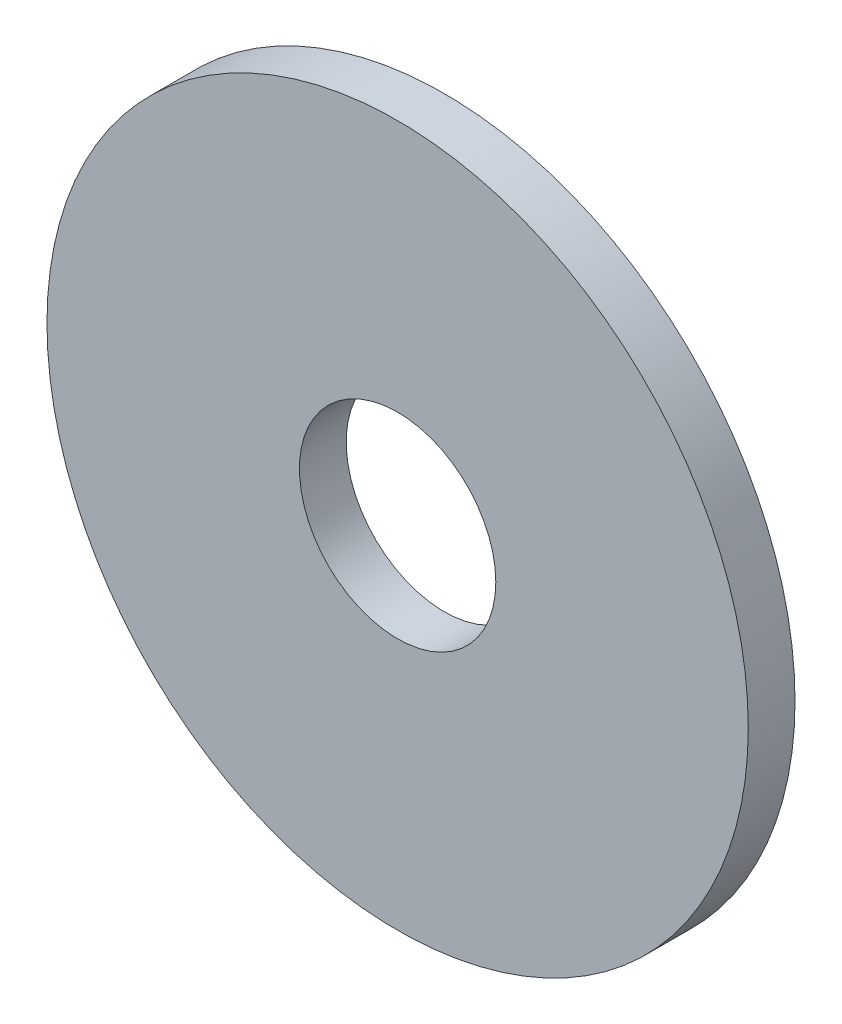
ISO-10303-21;
HEADER;
FILE_DESCRIPTION(('STEP AP214'),'2;1');
FILE_NAME('part.step','',(''),(''),'','','');
FILE_SCHEMA(('AUTOMOTIVE_DESIGN { 1 0 10303 214 1 1 1 1 }'));
ENDSEC;
DATA;
#1=APPLICATION_CONTEXT('core data for automotive mechanical design processes');
#2=APPLICATION_PROTOCOL_DEFINITION('international standard','automotive_design',2000,#1);
#3=PRODUCT_CONTEXT('',#1,'mechanical');
#4=PRODUCT('Part','Part','',(#3));
#5=PRODUCT_RELATED_PRODUCT_CATEGORY('part','',(#4));
#6=PRODUCT_DEFINITION_FORMATION('','',#4);
#7=PRODUCT_DEFINITION_CONTEXT('part definition',#1,'design');
#8=PRODUCT_DEFINITION('design','',#6,#7);
#9=PRODUCT_DEFINITION_SHAPE('','',#8);
#10=(LENGTH_UNIT() NAMED_UNIT(*) SI_UNIT(.MILLI.,.METRE.));
#11=(NAMED_UNIT(*) PLANE_ANGLE_UNIT() SI_UNIT($,.RADIAN.));
#12=(NAMED_UNIT(*) SI_UNIT($,.STERADIAN.) SOLID_ANGLE_UNIT());
#13=UNCERTAINTY_MEASURE_WITH_UNIT(LENGTH_MEASURE(1.E-05),#10,'distance_accuracy_value','');
#14=(GEOMETRIC_REPRESENTATION_CONTEXT(3) GLOBAL_UNCERTAINTY_ASSIGNED_CONTEXT((#13)) GLOBAL_UNIT_ASSIGNED_CONTEXT((#10,
#11,#12)) REPRESENTATION_CONTEXT('',''));
#15=CARTESIAN_POINT('',(0.,0.,0.));
#16=DIRECTION('',(0.,0.,1.));
#17=DIRECTION('',(1.,0.,0.));
#18=AXIS2_PLACEMENT_3D('',#15,#16,#17);
#19=CARTESIAN_POINT('',(0.,0.,1.));
#20=DIRECTION('',(0.,0.,1.));
#21=DIRECTION('',(1.,0.,0.));
#22=AXIS2_PLACEMENT_3D('',#19,#20,#21);
#23=PLANE('',#22);
#24=CARTESIAN_POINT('',(0.,0.,1.));
#25=DIRECTION('',(0.,0.,1.));
#26=DIRECTION('',(1.,0.,0.));
#27=AXIS2_PLACEMENT_3D('',#24,#25,#26);
#28=CIRCLE('',#27,15.);
#29=CARTESIAN_POINT('',(15.,0.,1.));
#30=VERTEX_POINT('',#29);
#31=EDGE_CURVE('E10',#30,#30,#28,.T.);
#32=ORIENTED_EDGE('',*,*,#31,.T.);
#33=EDGE_LOOP('',(#32));
#34=FACE_BOUND('',#33,.T.);
#35=CARTESIAN_POINT('',(0.,0.,1.));
#36=DIRECTION('',(0.,0.,1.));
#37=DIRECTION('',(1.,0.,0.));
#38=AXIS2_PLACEMENT_3D('',#35,#36,#37);
#39=CIRCLE('',#38,4.2);
#40=CARTESIAN_POINT('',(4.2,0.,1.));
#41=VERTEX_POINT('',#40);
#42=EDGE_CURVE('E42',#41,#41,#39,.T.);
#43=ORIENTED_EDGE('',*,*,#42,.F.);
#44=EDGE_LOOP('',(#43));
#45=FACE_BOUND('',#44,.T.);
#46=ADVANCED_FACE('F31',(#34,#45),#23,.T.);
#47=CARTESIAN_POINT('',(0.,0.,-1.));
#48=DIRECTION('',(0.,0.,1.));
#49=DIRECTION('',(1.,0.,0.));
#50=AXIS2_PLACEMENT_3D('',#47,#48,#49);
#51=PLANE('',#50);
#52=CARTESIAN_POINT('',(0.,0.,-1.));
#53=DIRECTION('',(0.,0.,1.));
#54=DIRECTION('',(1.,0.,0.));
#55=AXIS2_PLACEMENT_3D('',#52,#53,#54);
#56=CIRCLE('',#55,15.);
#57=CARTESIAN_POINT('',(15.,0.,-1.));
#58=VERTEX_POINT('',#57);
#59=EDGE_CURVE('E35',#58,#58,#56,.T.);
#60=ORIENTED_EDGE('',*,*,#59,.F.);
#61=EDGE_LOOP('',(#60));
#62=FACE_BOUND('',#61,.T.);
#63=CARTESIAN_POINT('',(0.,0.,-1.));
#64=DIRECTION('',(0.,0.,1.));
#65=DIRECTION('',(1.,0.,0.));
#66=AXIS2_PLACEMENT_3D('',#63,#64,#65);
#67=CIRCLE('',#66,4.2);
#68=CARTESIAN_POINT('',(4.2,0.,-1.));
#69=VERTEX_POINT('',#68);
#70=EDGE_CURVE('E44',#69,#69,#67,.T.);
#71=ORIENTED_EDGE('',*,*,#70,.T.);
#72=EDGE_LOOP('',(#71));
#73=FACE_BOUND('',#72,.T.);
#74=ADVANCED_FACE('F54',(#62,#73),#51,.F.);
#75=CARTESIAN_POINT('',(0.,0.,1.));
#76=DIRECTION('',(0.,0.,-1.));
#77=DIRECTION('',(-1.,0.,0.));
#78=AXIS2_PLACEMENT_3D('',#75,#76,#77);
#79=CYLINDRICAL_SURFACE('',#78,15.);
#80=ORIENTED_EDGE('',*,*,#31,.F.);
#81=EDGE_LOOP('',(#80));
#82=FACE_BOUND('',#81,.T.);
#83=ORIENTED_EDGE('',*,*,#59,.T.);
#84=EDGE_LOOP('',(#83));
#85=FACE_BOUND('',#84,.T.);
#86=ADVANCED_FACE('F33',(#82,#85),#79,.T.);
#87=CARTESIAN_POINT('',(0.,0.,1.));
#88=DIRECTION('',(0.,0.,-1.));
#89=DIRECTION('',(-1.,0.,0.));
#90=AXIS2_PLACEMENT_3D('',#87,#88,#89);
#91=CYLINDRICAL_SURFACE('',#90,4.2);
#92=ORIENTED_EDGE('',*,*,#42,.T.);
#93=EDGE_LOOP('',(#92));
#94=FACE_BOUND('',#93,.T.);
#95=ORIENTED_EDGE('',*,*,#70,.F.);
#96=EDGE_LOOP('',(#95));
#97=FACE_BOUND('',#96,.T.);
#98=ADVANCED_FACE('F50',(#94,#97),#91,.F.);
#99=CLOSED_SHELL('',(#46,#74,#86,#98));
#100=MANIFOLD_SOLID_BREP('B2',#99);
#101=ADVANCED_BREP_SHAPE_REPRESENTATION('',(#18,#100),#14);
#102=SHAPE_DEFINITION_REPRESENTATION(#9,#101);
ENDSEC;
END-ISO-10303-21;
